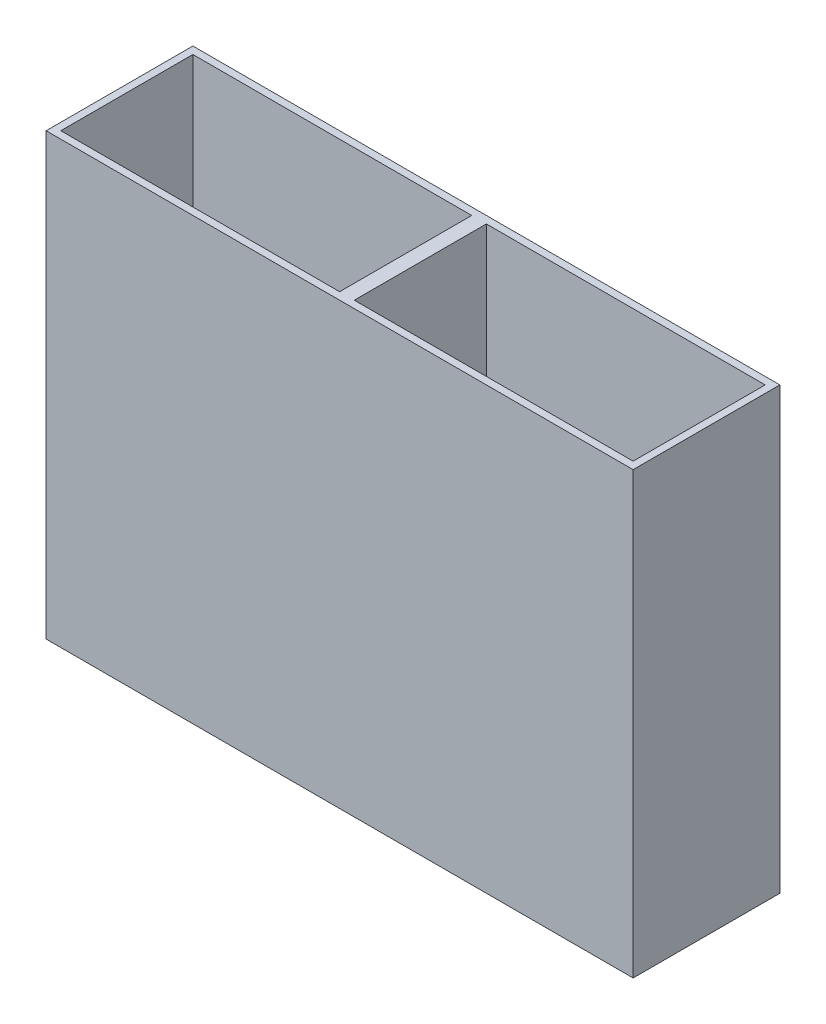
ISO-10303-21;
HEADER;
FILE_DESCRIPTION(('STEP AP214'),'2;1');
FILE_NAME('part.step','',(''),(''),'','','');
FILE_SCHEMA(('AUTOMOTIVE_DESIGN { 1 0 10303 214 1 1 1 1 }'));
ENDSEC;
DATA;
#1=APPLICATION_CONTEXT('core data for automotive mechanical design processes');
#2=APPLICATION_PROTOCOL_DEFINITION('international standard','automotive_design',2000,#1);
#3=PRODUCT_CONTEXT('',#1,'mechanical');
#4=PRODUCT('Part','Part','',(#3));
#5=PRODUCT_RELATED_PRODUCT_CATEGORY('part','',(#4));
#6=PRODUCT_DEFINITION_FORMATION('','',#4);
#7=PRODUCT_DEFINITION_CONTEXT('part definition',#1,'design');
#8=PRODUCT_DEFINITION('design','',#6,#7);
#9=PRODUCT_DEFINITION_SHAPE('','',#8);
#10=(LENGTH_UNIT() NAMED_UNIT(*) SI_UNIT(.MILLI.,.METRE.));
#11=(NAMED_UNIT(*) PLANE_ANGLE_UNIT() SI_UNIT($,.RADIAN.));
#12=(NAMED_UNIT(*) SI_UNIT($,.STERADIAN.) SOLID_ANGLE_UNIT());
#13=UNCERTAINTY_MEASURE_WITH_UNIT(LENGTH_MEASURE(1.E-05),#10,'distance_accuracy_value','');
#14=(GEOMETRIC_REPRESENTATION_CONTEXT(3) GLOBAL_UNCERTAINTY_ASSIGNED_CONTEXT((#13)) GLOBAL_UNIT_ASSIGNED_CONTEXT((#10,
#11,#12)) REPRESENTATION_CONTEXT('',''));
#15=CARTESIAN_POINT('',(0.,0.,0.));
#16=DIRECTION('',(0.,0.,1.));
#17=DIRECTION('',(1.,0.,0.));
#18=AXIS2_PLACEMENT_3D('',#15,#16,#17);
#19=CARTESIAN_POINT('',(254.,381.,-63.5));
#20=DIRECTION('',(-1.,0.,0.));
#21=DIRECTION('',(0.,0.,1.));
#22=AXIS2_PLACEMENT_3D('',#19,#20,#21);
#23=PLANE('',#22);
#24=DIRECTION('',(0.,0.,-1.));
#25=VECTOR('',#24,1.);
#26=CARTESIAN_POINT('',(254.,0.,-63.5));
#27=LINE('',#26,#25);
#28=CARTESIAN_POINT('',(254.,0.,63.5));
#29=VERTEX_POINT('',#28);
#30=CARTESIAN_POINT('',(254.,0.,-63.5));
#31=VERTEX_POINT('',#30);
#32=EDGE_CURVE('E174',#29,#31,#27,.T.);
#33=ORIENTED_EDGE('',*,*,#32,.T.);
#34=DIRECTION('',(0.,-1.,0.));
#35=VECTOR('',#34,1.);
#36=CARTESIAN_POINT('',(254.,381.,-63.5));
#37=LINE('',#36,#35);
#38=CARTESIAN_POINT('',(254.,381.,-63.5));
#39=VERTEX_POINT('',#38);
#40=EDGE_CURVE('E11',#39,#31,#37,.T.);
#41=ORIENTED_EDGE('',*,*,#40,.F.);
#42=DIRECTION('',(0.,0.,-1.));
#43=VECTOR('',#42,1.);
#44=CARTESIAN_POINT('',(254.,381.,-63.5));
#45=LINE('',#44,#43);
#46=CARTESIAN_POINT('',(254.,381.,63.5));
#47=VERTEX_POINT('',#46);
#48=EDGE_CURVE('E221',#47,#39,#45,.T.);
#49=ORIENTED_EDGE('',*,*,#48,.F.);
#50=DIRECTION('',(0.,-1.,0.));
#51=VECTOR('',#50,1.);
#52=CARTESIAN_POINT('',(254.,381.,63.5));
#53=LINE('',#52,#51);
#54=EDGE_CURVE('E235',#47,#29,#53,.T.);
#55=ORIENTED_EDGE('',*,*,#54,.T.);
#56=EDGE_LOOP('',(#33,#41,#49,#55));
#57=FACE_BOUND('',#56,.T.);
#58=ADVANCED_FACE('F39',(#57),#23,.F.);
#59=CARTESIAN_POINT('',(-254.,381.,-63.5));
#60=DIRECTION('',(0.,0.,1.));
#61=DIRECTION('',(1.,0.,0.));
#62=AXIS2_PLACEMENT_3D('',#59,#60,#61);
#63=PLANE('',#62);
#64=DIRECTION('',(-1.,0.,0.));
#65=VECTOR('',#64,1.);
#66=CARTESIAN_POINT('',(-254.,0.,-63.5));
#67=LINE('',#66,#65);
#68=CARTESIAN_POINT('',(-254.,0.,-63.5));
#69=VERTEX_POINT('',#68);
#70=EDGE_CURVE('E239',#31,#69,#67,.T.);
#71=ORIENTED_EDGE('',*,*,#70,.T.);
#72=DIRECTION('',(0.,-1.,0.));
#73=VECTOR('',#72,1.);
#74=CARTESIAN_POINT('',(-254.,381.,-63.5));
#75=LINE('',#74,#73);
#76=CARTESIAN_POINT('',(-254.,381.,-63.5));
#77=VERTEX_POINT('',#76);
#78=EDGE_CURVE('E47',#77,#69,#75,.T.);
#79=ORIENTED_EDGE('',*,*,#78,.F.);
#80=DIRECTION('',(-1.,0.,0.));
#81=VECTOR('',#80,1.);
#82=CARTESIAN_POINT('',(-254.,381.,-63.5));
#83=LINE('',#82,#81);
#84=EDGE_CURVE('E225',#39,#77,#83,.T.);
#85=ORIENTED_EDGE('',*,*,#84,.F.);
#86=ORIENTED_EDGE('',*,*,#40,.T.);
#87=EDGE_LOOP('',(#71,#79,#85,#86));
#88=FACE_BOUND('',#87,.T.);
#89=ADVANCED_FACE('F275',(#88),#63,.F.);
#90=CARTESIAN_POINT('',(-254.,381.,-63.5));
#91=DIRECTION('',(1.,0.,0.));
#92=DIRECTION('',(0.,0.,-1.));
#93=AXIS2_PLACEMENT_3D('',#90,#91,#92);
#94=PLANE('',#93);
#95=DIRECTION('',(0.,0.,1.));
#96=VECTOR('',#95,1.);
#97=CARTESIAN_POINT('',(-254.,0.,-63.5));
#98=LINE('',#97,#96);
#99=CARTESIAN_POINT('',(-254.,0.,63.5));
#100=VERTEX_POINT('',#99);
#101=EDGE_CURVE('E242',#69,#100,#98,.T.);
#102=ORIENTED_EDGE('',*,*,#101,.T.);
#103=DIRECTION('',(0.,-1.,0.));
#104=VECTOR('',#103,1.);
#105=CARTESIAN_POINT('',(-254.,381.,63.5));
#106=LINE('',#105,#104);
#107=CARTESIAN_POINT('',(-254.,381.,63.5));
#108=VERTEX_POINT('',#107);
#109=EDGE_CURVE('E250',#108,#100,#106,.T.);
#110=ORIENTED_EDGE('',*,*,#109,.F.);
#111=DIRECTION('',(0.,0.,1.));
#112=VECTOR('',#111,1.);
#113=CARTESIAN_POINT('',(-254.,381.,-63.5));
#114=LINE('',#113,#112);
#115=EDGE_CURVE('E229',#77,#108,#114,.T.);
#116=ORIENTED_EDGE('',*,*,#115,.F.);
#117=ORIENTED_EDGE('',*,*,#78,.T.);
#118=EDGE_LOOP('',(#102,#110,#116,#117));
#119=FACE_BOUND('',#118,.T.);
#120=ADVANCED_FACE('F259',(#119),#94,.F.);
#121=CARTESIAN_POINT('',(-254.,381.,63.5));
#122=DIRECTION('',(0.,0.,-1.));
#123=DIRECTION('',(-1.,0.,0.));
#124=AXIS2_PLACEMENT_3D('',#121,#122,#123);
#125=PLANE('',#124);
#126=DIRECTION('',(1.,0.,0.));
#127=VECTOR('',#126,1.);
#128=CARTESIAN_POINT('',(-254.,0.,63.5));
#129=LINE('',#128,#127);
#130=EDGE_CURVE('E226',#100,#29,#129,.T.);
#131=ORIENTED_EDGE('',*,*,#130,.T.);
#132=ORIENTED_EDGE('',*,*,#54,.F.);
#133=DIRECTION('',(1.,0.,0.));
#134=VECTOR('',#133,1.);
#135=CARTESIAN_POINT('',(-254.,381.,63.5));
#136=LINE('',#135,#134);
#137=EDGE_CURVE('E232',#108,#47,#136,.T.);
#138=ORIENTED_EDGE('',*,*,#137,.F.);
#139=ORIENTED_EDGE('',*,*,#109,.T.);
#140=EDGE_LOOP('',(#131,#132,#138,#139));
#141=FACE_BOUND('',#140,.T.);
#142=ADVANCED_FACE('F268',(#141),#125,.F.);
#143=CARTESIAN_POINT('',(0.,381.,0.));
#144=DIRECTION('',(0.,1.,0.));
#145=DIRECTION('',(0.,0.,1.));
#146=AXIS2_PLACEMENT_3D('',#143,#144,#145);
#147=PLANE('',#146);
#148=DIRECTION('',(0.,0.,-1.));
#149=VECTOR('',#148,1.);
#150=CARTESIAN_POINT('',(-6.35000000000002,381.,-57.15));
#151=LINE('',#150,#149);
#152=CARTESIAN_POINT('',(-6.34999999999999,381.,57.15));
#153=VERTEX_POINT('',#152);
#154=CARTESIAN_POINT('',(-6.35000000000002,381.,-57.15));
#155=VERTEX_POINT('',#154);
#156=EDGE_CURVE('E54',#153,#155,#151,.T.);
#157=ORIENTED_EDGE('',*,*,#156,.F.);
#158=DIRECTION('',(1.,0.,0.));
#159=VECTOR('',#158,1.);
#160=CARTESIAN_POINT('',(-247.65,381.,57.15));
#161=LINE('',#160,#159);
#162=CARTESIAN_POINT('',(-247.65,381.,57.15));
#163=VERTEX_POINT('',#162);
#164=EDGE_CURVE('E151',#163,#153,#161,.T.);
#165=ORIENTED_EDGE('',*,*,#164,.F.);
#166=DIRECTION('',(0.,0.,1.));
#167=VECTOR('',#166,1.);
#168=CARTESIAN_POINT('',(-247.65,381.,-57.15));
#169=LINE('',#168,#167);
#170=CARTESIAN_POINT('',(-247.65,381.,-57.15));
#171=VERTEX_POINT('',#170);
#172=EDGE_CURVE('E155',#171,#163,#169,.T.);
#173=ORIENTED_EDGE('',*,*,#172,.F.);
#174=DIRECTION('',(-1.,0.,0.));
#175=VECTOR('',#174,1.);
#176=CARTESIAN_POINT('',(-247.65,381.,-57.15));
#177=LINE('',#176,#175);
#178=EDGE_CURVE('E164',#155,#171,#177,.T.);
#179=ORIENTED_EDGE('',*,*,#178,.F.);
#180=EDGE_LOOP('',(#157,#165,#173,#179));
#181=FACE_BOUND('',#180,.T.);
#182=DIRECTION('',(-1.,0.,0.));
#183=VECTOR('',#182,1.);
#184=CARTESIAN_POINT('',(247.65,381.,-57.15));
#185=LINE('',#184,#183);
#186=CARTESIAN_POINT('',(247.65,381.,-57.15));
#187=VERTEX_POINT('',#186);
#188=CARTESIAN_POINT('',(6.34999999999991,381.,-57.15));
#189=VERTEX_POINT('',#188);
#190=EDGE_CURVE('E62',#187,#189,#185,.T.);
#191=ORIENTED_EDGE('',*,*,#190,.F.);
#192=DIRECTION('',(0.,0.,-1.));
#193=VECTOR('',#192,1.);
#194=CARTESIAN_POINT('',(247.65,381.,-57.15));
#195=LINE('',#194,#193);
#196=CARTESIAN_POINT('',(247.65,381.,57.15));
#197=VERTEX_POINT('',#196);
#198=EDGE_CURVE('E185',#197,#187,#195,.T.);
#199=ORIENTED_EDGE('',*,*,#198,.F.);
#200=DIRECTION('',(1.,0.,0.));
#201=VECTOR('',#200,1.);
#202=CARTESIAN_POINT('',(247.65,381.,57.15));
#203=LINE('',#202,#201);
#204=CARTESIAN_POINT('',(6.34999999999988,381.,57.15));
#205=VERTEX_POINT('',#204);
#206=EDGE_CURVE('E204',#205,#197,#203,.T.);
#207=ORIENTED_EDGE('',*,*,#206,.F.);
#208=DIRECTION('',(0.,0.,1.));
#209=VECTOR('',#208,1.);
#210=CARTESIAN_POINT('',(6.34999999999991,381.,-57.15));
#211=LINE('',#210,#209);
#212=EDGE_CURVE('E200',#189,#205,#211,.T.);
#213=ORIENTED_EDGE('',*,*,#212,.F.);
#214=EDGE_LOOP('',(#191,#199,#207,#213));
#215=FACE_BOUND('',#214,.T.);
#216=ORIENTED_EDGE('',*,*,#48,.T.);
#217=ORIENTED_EDGE('',*,*,#84,.T.);
#218=ORIENTED_EDGE('',*,*,#115,.T.);
#219=ORIENTED_EDGE('',*,*,#137,.T.);
#220=EDGE_LOOP('',(#216,#217,#218,#219));
#221=FACE_BOUND('',#220,.T.);
#222=ADVANCED_FACE('F274',(#181,#215,#221),#147,.T.);
#223=CARTESIAN_POINT('',(0.,0.,0.));
#224=DIRECTION('',(0.,1.,0.));
#225=DIRECTION('',(0.,0.,1.));
#226=AXIS2_PLACEMENT_3D('',#223,#224,#225);
#227=PLANE('',#226);
#228=ORIENTED_EDGE('',*,*,#32,.F.);
#229=ORIENTED_EDGE('',*,*,#130,.F.);
#230=ORIENTED_EDGE('',*,*,#101,.F.);
#231=ORIENTED_EDGE('',*,*,#70,.F.);
#232=EDGE_LOOP('',(#228,#229,#230,#231));
#233=FACE_BOUND('',#232,.T.);
#234=ADVANCED_FACE('F265',(#233),#227,.F.);
#235=CARTESIAN_POINT('',(247.65,1.27000000000005,-57.15));
#236=DIRECTION('',(0.,0.,-1.));
#237=DIRECTION('',(-1.,0.,0.));
#238=AXIS2_PLACEMENT_3D('',#235,#236,#237);
#239=PLANE('',#238);
#240=ORIENTED_EDGE('',*,*,#190,.T.);
#241=DIRECTION('',(0.,1.,0.));
#242=VECTOR('',#241,1.);
#243=CARTESIAN_POINT('',(6.34999999999991,1.27000000000005,-57.15));
#244=LINE('',#243,#242);
#245=CARTESIAN_POINT('',(6.34999999999991,1.27000000000005,-57.15));
#246=VERTEX_POINT('',#245);
#247=EDGE_CURVE('E197',#246,#189,#244,.T.);
#248=ORIENTED_EDGE('',*,*,#247,.F.);
#249=DIRECTION('',(-1.,0.,0.));
#250=VECTOR('',#249,1.);
#251=CARTESIAN_POINT('',(247.65,1.27000000000005,-57.15));
#252=LINE('',#251,#250);
#253=CARTESIAN_POINT('',(247.65,1.27000000000005,-57.15));
#254=VERTEX_POINT('',#253);
#255=EDGE_CURVE('E180',#254,#246,#252,.T.);
#256=ORIENTED_EDGE('',*,*,#255,.F.);
#257=DIRECTION('',(0.,1.,0.));
#258=VECTOR('',#257,1.);
#259=CARTESIAN_POINT('',(247.65,1.27000000000005,-57.15));
#260=LINE('',#259,#258);
#261=EDGE_CURVE('E165',#254,#187,#260,.T.);
#262=ORIENTED_EDGE('',*,*,#261,.T.);
#263=EDGE_LOOP('',(#240,#248,#256,#262));
#264=FACE_BOUND('',#263,.T.);
#265=ADVANCED_FACE('F287',(#264),#239,.F.);
#266=CARTESIAN_POINT('',(247.65,1.27000000000005,-57.15));
#267=DIRECTION('',(1.,0.,0.));
#268=DIRECTION('',(0.,0.,-1.));
#269=AXIS2_PLACEMENT_3D('',#266,#267,#268);
#270=PLANE('',#269);
#271=ORIENTED_EDGE('',*,*,#198,.T.);
#272=ORIENTED_EDGE('',*,*,#261,.F.);
#273=DIRECTION('',(0.,0.,-1.));
#274=VECTOR('',#273,1.);
#275=CARTESIAN_POINT('',(247.65,1.27000000000005,-57.15));
#276=LINE('',#275,#274);
#277=CARTESIAN_POINT('',(247.65,1.27000000000005,57.15));
#278=VERTEX_POINT('',#277);
#279=EDGE_CURVE('E193',#278,#254,#276,.T.);
#280=ORIENTED_EDGE('',*,*,#279,.F.);
#281=DIRECTION('',(0.,1.,0.));
#282=VECTOR('',#281,1.);
#283=CARTESIAN_POINT('',(247.65,1.27000000000005,57.15));
#284=LINE('',#283,#282);
#285=EDGE_CURVE('E213',#278,#197,#284,.T.);
#286=ORIENTED_EDGE('',*,*,#285,.T.);
#287=EDGE_LOOP('',(#271,#272,#280,#286));
#288=FACE_BOUND('',#287,.T.);
#289=ADVANCED_FACE('F293',(#288),#270,.F.);
#290=CARTESIAN_POINT('',(247.65,1.27000000000005,57.15));
#291=DIRECTION('',(0.,0.,1.));
#292=DIRECTION('',(1.,0.,0.));
#293=AXIS2_PLACEMENT_3D('',#290,#291,#292);
#294=PLANE('',#293);
#295=ORIENTED_EDGE('',*,*,#206,.T.);
#296=ORIENTED_EDGE('',*,*,#285,.F.);
#297=DIRECTION('',(1.,0.,0.));
#298=VECTOR('',#297,1.);
#299=CARTESIAN_POINT('',(247.65,1.27000000000005,57.15));
#300=LINE('',#299,#298);
#301=CARTESIAN_POINT('',(6.34999999999988,1.27000000000005,57.15));
#302=VERTEX_POINT('',#301);
#303=EDGE_CURVE('E189',#302,#278,#300,.T.);
#304=ORIENTED_EDGE('',*,*,#303,.F.);
#305=DIRECTION('',(0.,1.,0.));
#306=VECTOR('',#305,1.);
#307=CARTESIAN_POINT('',(6.34999999999988,1.27000000000005,57.15));
#308=LINE('',#307,#306);
#309=EDGE_CURVE('E216',#302,#205,#308,.T.);
#310=ORIENTED_EDGE('',*,*,#309,.T.);
#311=EDGE_LOOP('',(#295,#296,#304,#310));
#312=FACE_BOUND('',#311,.T.);
#313=ADVANCED_FACE('F298',(#312),#294,.F.);
#314=CARTESIAN_POINT('',(6.34999999999991,1.27000000000005,-57.15));
#315=DIRECTION('',(-1.,0.,0.));
#316=DIRECTION('',(0.,0.,1.));
#317=AXIS2_PLACEMENT_3D('',#314,#315,#316);
#318=PLANE('',#317);
#319=ORIENTED_EDGE('',*,*,#212,.T.);
#320=ORIENTED_EDGE('',*,*,#309,.F.);
#321=DIRECTION('',(0.,0.,1.));
#322=VECTOR('',#321,1.);
#323=CARTESIAN_POINT('',(6.34999999999991,1.27000000000005,-57.15));
#324=LINE('',#323,#322);
#325=EDGE_CURVE('E184',#246,#302,#324,.T.);
#326=ORIENTED_EDGE('',*,*,#325,.F.);
#327=ORIENTED_EDGE('',*,*,#247,.T.);
#328=EDGE_LOOP('',(#319,#320,#326,#327));
#329=FACE_BOUND('',#328,.T.);
#330=ADVANCED_FACE('F294',(#329),#318,.F.);
#331=CARTESIAN_POINT('',(0.,1.27000000000005,0.));
#332=DIRECTION('',(0.,1.,0.));
#333=DIRECTION('',(0.,0.,1.));
#334=AXIS2_PLACEMENT_3D('',#331,#332,#333);
#335=PLANE('',#334);
#336=ORIENTED_EDGE('',*,*,#255,.T.);
#337=ORIENTED_EDGE('',*,*,#325,.T.);
#338=ORIENTED_EDGE('',*,*,#303,.T.);
#339=ORIENTED_EDGE('',*,*,#279,.T.);
#340=EDGE_LOOP('',(#336,#337,#338,#339));
#341=FACE_BOUND('',#340,.T.);
#342=ADVANCED_FACE('F297',(#341),#335,.T.);
#343=CARTESIAN_POINT('',(-6.35000000000002,1.27000000000005,-57.15));
#344=DIRECTION('',(1.,0.,0.));
#345=DIRECTION('',(0.,0.,-1.));
#346=AXIS2_PLACEMENT_3D('',#343,#344,#345);
#347=PLANE('',#346);
#348=ORIENTED_EDGE('',*,*,#156,.T.);
#349=DIRECTION('',(0.,1.,0.));
#350=VECTOR('',#349,1.);
#351=CARTESIAN_POINT('',(-6.35000000000002,1.27000000000005,-57.15));
#352=LINE('',#351,#350);
#353=CARTESIAN_POINT('',(-6.35000000000002,1.27000000000005,-57.15));
#354=VERTEX_POINT('',#353);
#355=EDGE_CURVE('E126',#354,#155,#352,.T.);
#356=ORIENTED_EDGE('',*,*,#355,.F.);
#357=DIRECTION('',(0.,0.,-1.));
#358=VECTOR('',#357,1.);
#359=CARTESIAN_POINT('',(-6.35000000000002,1.27000000000005,-57.15));
#360=LINE('',#359,#358);
#361=CARTESIAN_POINT('',(-6.34999999999999,1.27000000000005,57.15));
#362=VERTEX_POINT('',#361);
#363=EDGE_CURVE('E130',#362,#354,#360,.T.);
#364=ORIENTED_EDGE('',*,*,#363,.F.);
#365=DIRECTION('',(0.,1.,0.));
#366=VECTOR('',#365,1.);
#367=CARTESIAN_POINT('',(-6.34999999999999,1.27000000000005,57.15));
#368=LINE('',#367,#366);
#369=EDGE_CURVE('E171',#362,#153,#368,.T.);
#370=ORIENTED_EDGE('',*,*,#369,.T.);
#371=EDGE_LOOP('',(#348,#356,#364,#370));
#372=FACE_BOUND('',#371,.T.);
#373=ADVANCED_FACE('F128',(#372),#347,.F.);
#374=CARTESIAN_POINT('',(-247.65,1.27000000000005,57.15));
#375=DIRECTION('',(0.,0.,1.));
#376=DIRECTION('',(1.,0.,0.));
#377=AXIS2_PLACEMENT_3D('',#374,#375,#376);
#378=PLANE('',#377);
#379=ORIENTED_EDGE('',*,*,#164,.T.);
#380=ORIENTED_EDGE('',*,*,#369,.F.);
#381=DIRECTION('',(1.,0.,0.));
#382=VECTOR('',#381,1.);
#383=CARTESIAN_POINT('',(-247.65,1.27000000000005,57.15));
#384=LINE('',#383,#382);
#385=CARTESIAN_POINT('',(-247.65,1.27000000000005,57.15));
#386=VERTEX_POINT('',#385);
#387=EDGE_CURVE('E137',#386,#362,#384,.T.);
#388=ORIENTED_EDGE('',*,*,#387,.F.);
#389=DIRECTION('',(0.,1.,0.));
#390=VECTOR('',#389,1.);
#391=CARTESIAN_POINT('',(-247.65,1.27000000000005,57.15));
#392=LINE('',#391,#390);
#393=EDGE_CURVE('E175',#386,#163,#392,.T.);
#394=ORIENTED_EDGE('',*,*,#393,.T.);
#395=EDGE_LOOP('',(#379,#380,#388,#394));
#396=FACE_BOUND('',#395,.T.);
#397=ADVANCED_FACE('F311',(#396),#378,.F.);
#398=CARTESIAN_POINT('',(-247.65,1.27000000000005,-57.15));
#399=DIRECTION('',(-1.,0.,0.));
#400=DIRECTION('',(0.,0.,1.));
#401=AXIS2_PLACEMENT_3D('',#398,#399,#400);
#402=PLANE('',#401);
#403=ORIENTED_EDGE('',*,*,#172,.T.);
#404=ORIENTED_EDGE('',*,*,#393,.F.);
#405=DIRECTION('',(0.,0.,1.));
#406=VECTOR('',#405,1.);
#407=CARTESIAN_POINT('',(-247.65,1.27000000000005,-57.15));
#408=LINE('',#407,#406);
#409=CARTESIAN_POINT('',(-247.65,1.27000000000005,-57.15));
#410=VERTEX_POINT('',#409);
#411=EDGE_CURVE('E146',#410,#386,#408,.T.);
#412=ORIENTED_EDGE('',*,*,#411,.F.);
#413=DIRECTION('',(0.,1.,0.));
#414=VECTOR('',#413,1.);
#415=CARTESIAN_POINT('',(-247.65,1.27000000000005,-57.15));
#416=LINE('',#415,#414);
#417=EDGE_CURVE('E136',#410,#171,#416,.T.);
#418=ORIENTED_EDGE('',*,*,#417,.T.);
#419=EDGE_LOOP('',(#403,#404,#412,#418));
#420=FACE_BOUND('',#419,.T.);
#421=ADVANCED_FACE('F314',(#420),#402,.F.);
#422=CARTESIAN_POINT('',(-247.65,1.27000000000005,-57.15));
#423=DIRECTION('',(0.,0.,-1.));
#424=DIRECTION('',(-1.,0.,0.));
#425=AXIS2_PLACEMENT_3D('',#422,#423,#424);
#426=PLANE('',#425);
#427=ORIENTED_EDGE('',*,*,#178,.T.);
#428=ORIENTED_EDGE('',*,*,#417,.F.);
#429=DIRECTION('',(-1.,0.,0.));
#430=VECTOR('',#429,1.);
#431=CARTESIAN_POINT('',(-247.65,1.27000000000005,-57.15));
#432=LINE('',#431,#430);
#433=EDGE_CURVE('E140',#354,#410,#432,.T.);
#434=ORIENTED_EDGE('',*,*,#433,.F.);
#435=ORIENTED_EDGE('',*,*,#355,.T.);
#436=EDGE_LOOP('',(#427,#428,#434,#435));
#437=FACE_BOUND('',#436,.T.);
#438=ADVANCED_FACE('F141',(#437),#426,.F.);
#439=CARTESIAN_POINT('',(0.,1.27000000000005,0.));
#440=DIRECTION('',(0.,1.,0.));
#441=DIRECTION('',(0.,0.,1.));
#442=AXIS2_PLACEMENT_3D('',#439,#440,#441);
#443=PLANE('',#442);
#444=ORIENTED_EDGE('',*,*,#363,.T.);
#445=ORIENTED_EDGE('',*,*,#433,.T.);
#446=ORIENTED_EDGE('',*,*,#411,.T.);
#447=ORIENTED_EDGE('',*,*,#387,.T.);
#448=EDGE_LOOP('',(#444,#445,#446,#447));
#449=FACE_BOUND('',#448,.T.);
#450=ADVANCED_FACE('F148',(#449),#443,.T.);
#451=CLOSED_SHELL('',(#58,#89,#120,#142,#222,#234,#265,#289,#313,#330,#342,#373,#397,#421,#438,#450));
#452=MANIFOLD_SOLID_BREP('B2',#451);
#453=ADVANCED_BREP_SHAPE_REPRESENTATION('',(#18,#452),#14);
#454=SHAPE_DEFINITION_REPRESENTATION(#9,#453);
ENDSEC;
END-ISO-10303-21;
